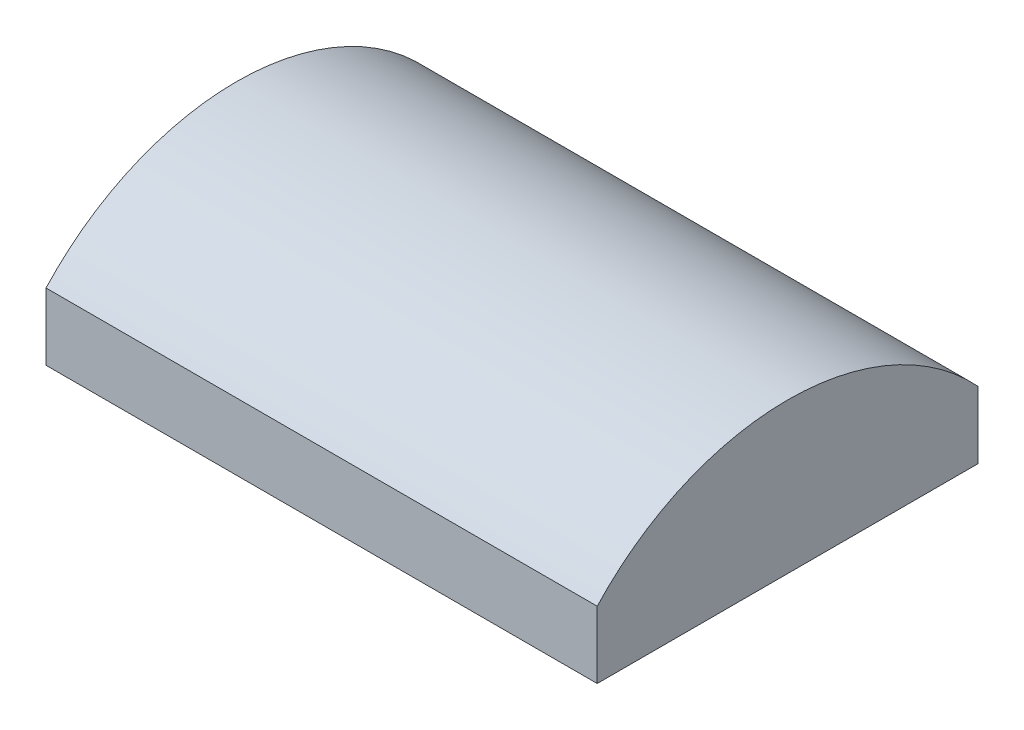
ISO-10303-21;
HEADER;
FILE_DESCRIPTION(('STEP AP214'),'2;1');
FILE_NAME('part.step','',(''),(''),'','','');
FILE_SCHEMA(('AUTOMOTIVE_DESIGN { 1 0 10303 214 1 1 1 1 }'));
ENDSEC;
DATA;
#1=APPLICATION_CONTEXT('core data for automotive mechanical design processes');
#2=APPLICATION_PROTOCOL_DEFINITION('international standard','automotive_design',2000,#1);
#3=PRODUCT_CONTEXT('',#1,'mechanical');
#4=PRODUCT('Part','Part','',(#3));
#5=PRODUCT_RELATED_PRODUCT_CATEGORY('part','',(#4));
#6=PRODUCT_DEFINITION_FORMATION('','',#4);
#7=PRODUCT_DEFINITION_CONTEXT('part definition',#1,'design');
#8=PRODUCT_DEFINITION('design','',#6,#7);
#9=PRODUCT_DEFINITION_SHAPE('','',#8);
#10=(LENGTH_UNIT() NAMED_UNIT(*) SI_UNIT(.MILLI.,.METRE.));
#11=(NAMED_UNIT(*) PLANE_ANGLE_UNIT() SI_UNIT($,.RADIAN.));
#12=(NAMED_UNIT(*) SI_UNIT($,.STERADIAN.) SOLID_ANGLE_UNIT());
#13=UNCERTAINTY_MEASURE_WITH_UNIT(LENGTH_MEASURE(1.E-05),#10,'distance_accuracy_value','');
#14=(GEOMETRIC_REPRESENTATION_CONTEXT(3) GLOBAL_UNCERTAINTY_ASSIGNED_CONTEXT((#13)) GLOBAL_UNIT_ASSIGNED_CONTEXT((#10,
#11,#12)) REPRESENTATION_CONTEXT('',''));
#15=CARTESIAN_POINT('',(0.,0.,0.));
#16=DIRECTION('',(0.,0.,1.));
#17=DIRECTION('',(1.,0.,0.));
#18=AXIS2_PLACEMENT_3D('',#15,#16,#17);
#19=CARTESIAN_POINT('',(0.,70.8406,0.));
#20=DIRECTION('',(0.,1.,0.));
#21=DIRECTION('',(0.,0.,1.));
#22=AXIS2_PLACEMENT_3D('',#19,#20,#21);
#23=PLANE('',#22);
#24=DIRECTION('',(0.,0.,1.));
#25=VECTOR('',#24,1.);
#26=CARTESIAN_POINT('',(-71.882,70.8406,54.483));
#27=LINE('',#26,#25);
#28=CARTESIAN_POINT('',(-71.882,70.8406,-47.498));
#29=VERTEX_POINT('',#28);
#30=CARTESIAN_POINT('',(-71.882,70.8406,47.498));
#31=VERTEX_POINT('',#30);
#32=EDGE_CURVE('E116',#29,#31,#27,.T.);
#33=ORIENTED_EDGE('',*,*,#32,.T.);
#34=DIRECTION('',(1.,0.,0.));
#35=VECTOR('',#34,1.);
#36=CARTESIAN_POINT('',(-78.867,70.8406,47.498));
#37=LINE('',#36,#35);
#38=CARTESIAN_POINT('',(71.882,70.8406,47.498));
#39=VERTEX_POINT('',#38);
#40=EDGE_CURVE('E119',#31,#39,#37,.T.);
#41=ORIENTED_EDGE('',*,*,#40,.T.);
#42=DIRECTION('',(0.,0.,-1.));
#43=VECTOR('',#42,1.);
#44=CARTESIAN_POINT('',(71.882,70.8406,54.483));
#45=LINE('',#44,#43);
#46=CARTESIAN_POINT('',(71.882,70.8406,-47.498));
#47=VERTEX_POINT('',#46);
#48=EDGE_CURVE('E130',#39,#47,#45,.T.);
#49=ORIENTED_EDGE('',*,*,#48,.T.);
#50=DIRECTION('',(-1.,0.,0.));
#51=VECTOR('',#50,1.);
#52=CARTESIAN_POINT('',(-78.867,70.8406,-47.498));
#53=LINE('',#52,#51);
#54=EDGE_CURVE('E128',#47,#29,#53,.T.);
#55=ORIENTED_EDGE('',*,*,#54,.T.);
#56=EDGE_LOOP('',(#33,#41,#49,#55));
#57=FACE_BOUND('',#56,.T.);
#58=DIRECTION('',(1.,0.,0.));
#59=VECTOR('',#58,1.);
#60=CARTESIAN_POINT('',(-78.867,70.8406,54.483));
#61=LINE('',#60,#59);
#62=CARTESIAN_POINT('',(-78.867,70.8406,54.483));
#63=VERTEX_POINT('',#62);
#64=CARTESIAN_POINT('',(78.867,70.8406,54.483));
#65=VERTEX_POINT('',#64);
#66=EDGE_CURVE('E155',#63,#65,#61,.T.);
#67=ORIENTED_EDGE('',*,*,#66,.F.);
#68=DIRECTION('',(0.,0.,1.));
#69=VECTOR('',#68,1.);
#70=CARTESIAN_POINT('',(-78.867,70.8406,54.483));
#71=LINE('',#70,#69);
#72=CARTESIAN_POINT('',(-78.867,70.8406,-54.483));
#73=VERTEX_POINT('',#72);
#74=EDGE_CURVE('E162',#73,#63,#71,.T.);
#75=ORIENTED_EDGE('',*,*,#74,.F.);
#76=DIRECTION('',(-1.,0.,0.));
#77=VECTOR('',#76,1.);
#78=CARTESIAN_POINT('',(-78.867,70.8406,-54.483));
#79=LINE('',#78,#77);
#80=CARTESIAN_POINT('',(78.867,70.8406,-54.483));
#81=VERTEX_POINT('',#80);
#82=EDGE_CURVE('E40',#81,#73,#79,.T.);
#83=ORIENTED_EDGE('',*,*,#82,.F.);
#84=DIRECTION('',(0.,0.,-1.));
#85=VECTOR('',#84,1.);
#86=CARTESIAN_POINT('',(78.867,70.8406,54.483));
#87=LINE('',#86,#85);
#88=EDGE_CURVE('E11',#65,#81,#87,.T.);
#89=ORIENTED_EDGE('',*,*,#88,.F.);
#90=EDGE_LOOP('',(#67,#75,#83,#89));
#91=FACE_BOUND('',#90,.T.);
#92=ADVANCED_FACE('F33',(#57,#91),#23,.F.);
#93=CARTESIAN_POINT('',(-78.867,114.1349,-54.483));
#94=DIRECTION('',(0.,0.,1.));
#95=DIRECTION('',(1.,0.,0.));
#96=AXIS2_PLACEMENT_3D('',#93,#94,#95);
#97=PLANE('',#96);
#98=DIRECTION('',(0.,-1.,0.));
#99=VECTOR('',#98,1.);
#100=CARTESIAN_POINT('',(78.867,114.1349,-54.483));
#101=LINE('',#100,#99);
#102=CARTESIAN_POINT('',(78.867,90.0049,-54.483));
#103=VERTEX_POINT('',#102);
#104=EDGE_CURVE('E152',#103,#81,#101,.T.);
#105=ORIENTED_EDGE('',*,*,#104,.T.);
#106=ORIENTED_EDGE('',*,*,#82,.T.);
#107=DIRECTION('',(0.,-1.,0.));
#108=VECTOR('',#107,1.);
#109=CARTESIAN_POINT('',(-78.867,114.1349,-54.483));
#110=LINE('',#109,#108);
#111=CARTESIAN_POINT('',(-78.867,90.0049,-54.483));
#112=VERTEX_POINT('',#111);
#113=EDGE_CURVE('E149',#112,#73,#110,.T.);
#114=ORIENTED_EDGE('',*,*,#113,.F.);
#115=DIRECTION('',(-1.,0.,0.));
#116=VECTOR('',#115,1.);
#117=CARTESIAN_POINT('',(83.629525,90.0049,-54.483));
#118=LINE('',#117,#116);
#119=EDGE_CURVE('E139',#103,#112,#118,.T.);
#120=ORIENTED_EDGE('',*,*,#119,.F.);
#121=EDGE_LOOP('',(#105,#106,#114,#120));
#122=FACE_BOUND('',#121,.T.);
#123=ADVANCED_FACE('F166',(#122),#97,.F.);
#124=CARTESIAN_POINT('',(83.629525,39.7801154255319,0.));
#125=DIRECTION('',(-1.,0.,0.));
#126=DIRECTION('',(0.,0.,1.));
#127=AXIS2_PLACEMENT_3D('',#124,#125,#126);
#128=CYLINDRICAL_SURFACE('',#127,74.1007845744681);
#129=ORIENTED_EDGE('',*,*,#119,.T.);
#130=CARTESIAN_POINT('',(-78.867,39.7801154255319,0.));
#131=DIRECTION('',(1.,0.,0.));
#132=DIRECTION('',(0.,0.,-1.));
#133=AXIS2_PLACEMENT_3D('',#130,#131,#132);
#134=CIRCLE('',#133,74.1007845744681);
#135=CARTESIAN_POINT('',(-78.867,90.0049,54.483));
#136=VERTEX_POINT('',#135);
#137=EDGE_CURVE('E133',#112,#136,#134,.T.);
#138=ORIENTED_EDGE('',*,*,#137,.T.);
#139=DIRECTION('',(-1.,0.,0.));
#140=VECTOR('',#139,1.);
#141=CARTESIAN_POINT('',(83.629525,90.0049,54.483));
#142=LINE('',#141,#140);
#143=CARTESIAN_POINT('',(78.867,90.0049,54.483));
#144=VERTEX_POINT('',#143);
#145=EDGE_CURVE('E138',#144,#136,#142,.T.);
#146=ORIENTED_EDGE('',*,*,#145,.F.);
#147=CARTESIAN_POINT('',(78.867,39.7801154255319,0.));
#148=DIRECTION('',(-1.,0.,0.));
#149=DIRECTION('',(0.,0.,1.));
#150=AXIS2_PLACEMENT_3D('',#147,#148,#149);
#151=CIRCLE('',#150,74.1007845744681);
#152=EDGE_CURVE('E141',#103,#144,#151,.F.);
#153=ORIENTED_EDGE('',*,*,#152,.F.);
#154=EDGE_LOOP('',(#129,#138,#146,#153));
#155=FACE_BOUND('',#154,.T.);
#156=ADVANCED_FACE('F175',(#155),#128,.T.);
#157=CARTESIAN_POINT('',(78.867,114.1349,54.483));
#158=DIRECTION('',(-1.,0.,0.));
#159=DIRECTION('',(0.,0.,1.));
#160=AXIS2_PLACEMENT_3D('',#157,#158,#159);
#161=PLANE('',#160);
#162=DIRECTION('',(0.,-1.,0.));
#163=VECTOR('',#162,1.);
#164=CARTESIAN_POINT('',(78.867,114.1349,54.483));
#165=LINE('',#164,#163);
#166=EDGE_CURVE('E146',#144,#65,#165,.T.);
#167=ORIENTED_EDGE('',*,*,#166,.T.);
#168=ORIENTED_EDGE('',*,*,#88,.T.);
#169=ORIENTED_EDGE('',*,*,#104,.F.);
#170=ORIENTED_EDGE('',*,*,#152,.T.);
#171=EDGE_LOOP('',(#167,#168,#169,#170));
#172=FACE_BOUND('',#171,.T.);
#173=ADVANCED_FACE('F179',(#172),#161,.F.);
#174=CARTESIAN_POINT('',(-78.867,114.1349,54.483));
#175=DIRECTION('',(1.,0.,0.));
#176=DIRECTION('',(0.,0.,-1.));
#177=AXIS2_PLACEMENT_3D('',#174,#175,#176);
#178=PLANE('',#177);
#179=ORIENTED_EDGE('',*,*,#113,.T.);
#180=ORIENTED_EDGE('',*,*,#74,.T.);
#181=DIRECTION('',(0.,-1.,0.));
#182=VECTOR('',#181,1.);
#183=CARTESIAN_POINT('',(-78.867,114.1349,54.483));
#184=LINE('',#183,#182);
#185=EDGE_CURVE('E148',#136,#63,#184,.T.);
#186=ORIENTED_EDGE('',*,*,#185,.F.);
#187=ORIENTED_EDGE('',*,*,#137,.F.);
#188=EDGE_LOOP('',(#179,#180,#186,#187));
#189=FACE_BOUND('',#188,.T.);
#190=ADVANCED_FACE('F173',(#189),#178,.F.);
#191=CARTESIAN_POINT('',(-78.867,114.1349,54.483));
#192=DIRECTION('',(0.,0.,-1.));
#193=DIRECTION('',(-1.,0.,0.));
#194=AXIS2_PLACEMENT_3D('',#191,#192,#193);
#195=PLANE('',#194);
#196=ORIENTED_EDGE('',*,*,#185,.T.);
#197=ORIENTED_EDGE('',*,*,#66,.T.);
#198=ORIENTED_EDGE('',*,*,#166,.F.);
#199=ORIENTED_EDGE('',*,*,#145,.T.);
#200=EDGE_LOOP('',(#196,#197,#198,#199));
#201=FACE_BOUND('',#200,.T.);
#202=ADVANCED_FACE('F178',(#201),#195,.F.);
#203=CARTESIAN_POINT('',(-78.867,114.1349,-47.498));
#204=DIRECTION('',(0.,0.,1.));
#205=DIRECTION('',(1.,0.,0.));
#206=AXIS2_PLACEMENT_3D('',#203,#204,#205);
#207=PLANE('',#206);
#208=DIRECTION('',(0.,-1.,0.));
#209=VECTOR('',#208,1.);
#210=CARTESIAN_POINT('',(71.882,114.1349,-47.498));
#211=LINE('',#210,#209);
#212=CARTESIAN_POINT('',(71.882,87.1981345221412,-47.498));
#213=VERTEX_POINT('',#212);
#214=EDGE_CURVE('E47',#213,#47,#211,.T.);
#215=ORIENTED_EDGE('',*,*,#214,.F.);
#216=DIRECTION('',(-1.,0.,0.));
#217=VECTOR('',#216,1.);
#218=CARTESIAN_POINT('',(71.882,87.1981345221412,-47.498));
#219=LINE('',#218,#217);
#220=CARTESIAN_POINT('',(-71.882,87.1981345221412,-47.498));
#221=VERTEX_POINT('',#220);
#222=EDGE_CURVE('E96',#213,#221,#219,.T.);
#223=ORIENTED_EDGE('',*,*,#222,.T.);
#224=DIRECTION('',(0.,-1.,0.));
#225=VECTOR('',#224,1.);
#226=CARTESIAN_POINT('',(-71.882,114.1349,-47.498));
#227=LINE('',#226,#225);
#228=EDGE_CURVE('E100',#221,#29,#227,.T.);
#229=ORIENTED_EDGE('',*,*,#228,.T.);
#230=ORIENTED_EDGE('',*,*,#54,.F.);
#231=EDGE_LOOP('',(#215,#223,#229,#230));
#232=FACE_BOUND('',#231,.T.);
#233=ADVANCED_FACE('F98',(#232),#207,.T.);
#234=CARTESIAN_POINT('',(83.629525,39.7801154255319,0.));
#235=DIRECTION('',(-1.,0.,0.));
#236=DIRECTION('',(0.,0.,1.));
#237=AXIS2_PLACEMENT_3D('',#234,#235,#236);
#238=CYLINDRICAL_SURFACE('',#237,67.1157845744681);
#239=ORIENTED_EDGE('',*,*,#222,.F.);
#240=CARTESIAN_POINT('',(71.882,39.7801154255319,0.));
#241=DIRECTION('',(-1.,0.,0.));
#242=DIRECTION('',(0.,0.,1.));
#243=AXIS2_PLACEMENT_3D('',#240,#241,#242);
#244=CIRCLE('',#243,67.1157845744681);
#245=CARTESIAN_POINT('',(71.882,87.1981345221412,47.498));
#246=VERTEX_POINT('',#245);
#247=EDGE_CURVE('E104',#213,#246,#244,.F.);
#248=ORIENTED_EDGE('',*,*,#247,.T.);
#249=DIRECTION('',(-1.,0.,0.));
#250=VECTOR('',#249,1.);
#251=CARTESIAN_POINT('',(71.882,87.1981345221412,47.498));
#252=LINE('',#251,#250);
#253=CARTESIAN_POINT('',(-71.882,87.1981345221412,47.498));
#254=VERTEX_POINT('',#253);
#255=EDGE_CURVE('E105',#246,#254,#252,.T.);
#256=ORIENTED_EDGE('',*,*,#255,.T.);
#257=CARTESIAN_POINT('',(-71.882,39.7801154255319,0.));
#258=DIRECTION('',(1.,0.,0.));
#259=DIRECTION('',(0.,0.,-1.));
#260=AXIS2_PLACEMENT_3D('',#257,#258,#259);
#261=CIRCLE('',#260,67.1157845744681);
#262=EDGE_CURVE('E108',#221,#254,#261,.T.);
#263=ORIENTED_EDGE('',*,*,#262,.F.);
#264=EDGE_LOOP('',(#239,#248,#256,#263));
#265=FACE_BOUND('',#264,.T.);
#266=ADVANCED_FACE('F109',(#265),#238,.F.);
#267=CARTESIAN_POINT('',(71.882,114.1349,54.483));
#268=DIRECTION('',(-1.,0.,0.));
#269=DIRECTION('',(0.,0.,1.));
#270=AXIS2_PLACEMENT_3D('',#267,#268,#269);
#271=PLANE('',#270);
#272=DIRECTION('',(0.,-1.,0.));
#273=VECTOR('',#272,1.);
#274=CARTESIAN_POINT('',(71.882,114.1349,47.498));
#275=LINE('',#274,#273);
#276=EDGE_CURVE('E121',#246,#39,#275,.T.);
#277=ORIENTED_EDGE('',*,*,#276,.F.);
#278=ORIENTED_EDGE('',*,*,#247,.F.);
#279=ORIENTED_EDGE('',*,*,#214,.T.);
#280=ORIENTED_EDGE('',*,*,#48,.F.);
#281=EDGE_LOOP('',(#277,#278,#279,#280));
#282=FACE_BOUND('',#281,.T.);
#283=ADVANCED_FACE('F206',(#282),#271,.T.);
#284=CARTESIAN_POINT('',(-71.882,114.1349,54.483));
#285=DIRECTION('',(1.,0.,0.));
#286=DIRECTION('',(0.,0.,-1.));
#287=AXIS2_PLACEMENT_3D('',#284,#285,#286);
#288=PLANE('',#287);
#289=ORIENTED_EDGE('',*,*,#228,.F.);
#290=ORIENTED_EDGE('',*,*,#262,.T.);
#291=DIRECTION('',(0.,-1.,0.));
#292=VECTOR('',#291,1.);
#293=CARTESIAN_POINT('',(-71.882,114.1349,47.498));
#294=LINE('',#293,#292);
#295=EDGE_CURVE('E117',#254,#31,#294,.T.);
#296=ORIENTED_EDGE('',*,*,#295,.T.);
#297=ORIENTED_EDGE('',*,*,#32,.F.);
#298=EDGE_LOOP('',(#289,#290,#296,#297));
#299=FACE_BOUND('',#298,.T.);
#300=ADVANCED_FACE('F114',(#299),#288,.T.);
#301=CARTESIAN_POINT('',(-78.867,114.1349,47.498));
#302=DIRECTION('',(0.,0.,-1.));
#303=DIRECTION('',(-1.,0.,0.));
#304=AXIS2_PLACEMENT_3D('',#301,#302,#303);
#305=PLANE('',#304);
#306=ORIENTED_EDGE('',*,*,#295,.F.);
#307=ORIENTED_EDGE('',*,*,#255,.F.);
#308=ORIENTED_EDGE('',*,*,#276,.T.);
#309=ORIENTED_EDGE('',*,*,#40,.F.);
#310=EDGE_LOOP('',(#306,#307,#308,#309));
#311=FACE_BOUND('',#310,.T.);
#312=ADVANCED_FACE('F193',(#311),#305,.T.);
#313=CLOSED_SHELL('',(#92,#123,#156,#173,#190,#202,#233,#266,#283,#300,#312));
#314=MANIFOLD_SOLID_BREP('B2',#313);
#315=ADVANCED_BREP_SHAPE_REPRESENTATION('',(#18,#314),#14);
#316=SHAPE_DEFINITION_REPRESENTATION(#9,#315);
ENDSEC;
END-ISO-10303-21;
